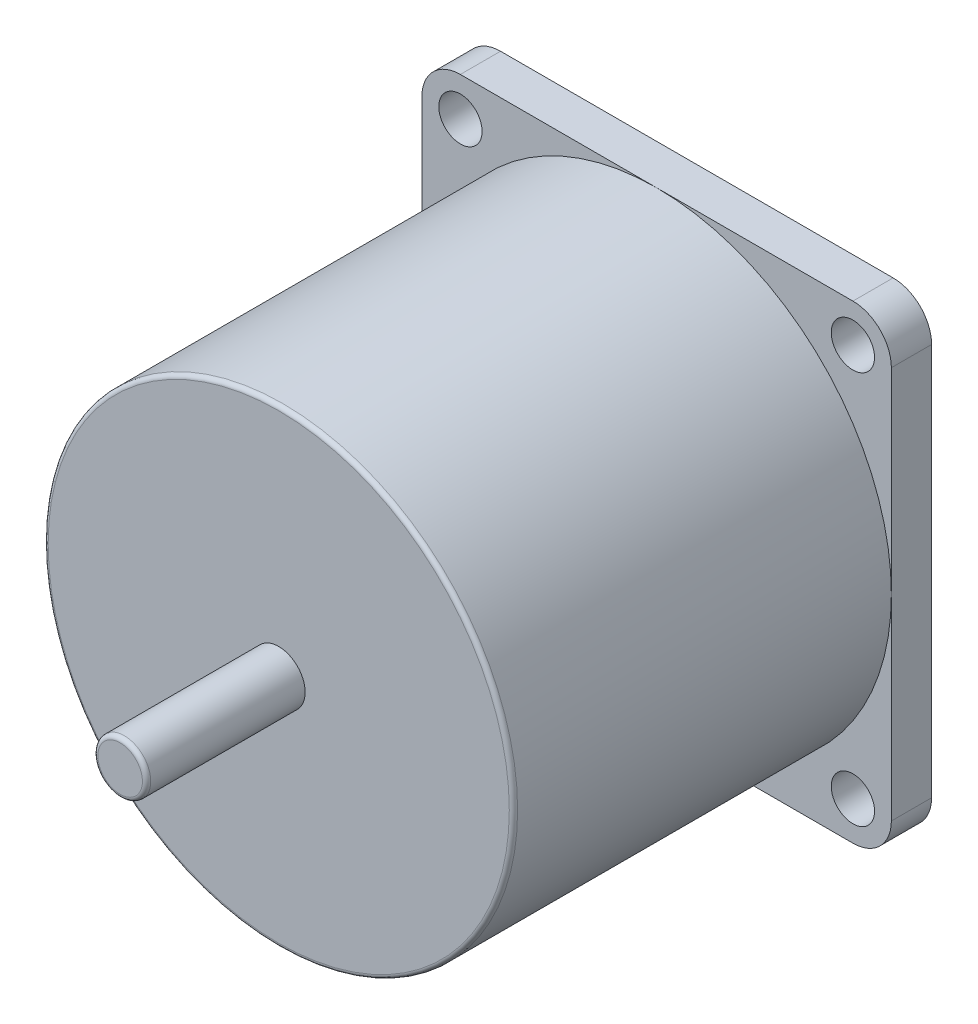
ISO-10303-21;
HEADER;
FILE_DESCRIPTION(('STEP AP214'),'2;1');
FILE_NAME('part.step','',(''),(''),'','','');
FILE_SCHEMA(('AUTOMOTIVE_DESIGN { 1 0 10303 214 1 1 1 1 }'));
ENDSEC;
DATA;
#1=APPLICATION_CONTEXT('core data for automotive mechanical design processes');
#2=APPLICATION_PROTOCOL_DEFINITION('international standard','automotive_design',2000,#1);
#3=PRODUCT_CONTEXT('',#1,'mechanical');
#4=PRODUCT('Part','Part','',(#3));
#5=PRODUCT_RELATED_PRODUCT_CATEGORY('part','',(#4));
#6=PRODUCT_DEFINITION_FORMATION('','',#4);
#7=PRODUCT_DEFINITION_CONTEXT('part definition',#1,'design');
#8=PRODUCT_DEFINITION('design','',#6,#7);
#9=PRODUCT_DEFINITION_SHAPE('','',#8);
#10=(LENGTH_UNIT() NAMED_UNIT(*) SI_UNIT(.MILLI.,.METRE.));
#11=(NAMED_UNIT(*) PLANE_ANGLE_UNIT() SI_UNIT($,.RADIAN.));
#12=(NAMED_UNIT(*) SI_UNIT($,.STERADIAN.) SOLID_ANGLE_UNIT());
#13=UNCERTAINTY_MEASURE_WITH_UNIT(LENGTH_MEASURE(1.E-05),#10,'distance_accuracy_value','');
#14=(GEOMETRIC_REPRESENTATION_CONTEXT(3) GLOBAL_UNCERTAINTY_ASSIGNED_CONTEXT((#13)) GLOBAL_UNIT_ASSIGNED_CONTEXT((#10,
#11,#12)) REPRESENTATION_CONTEXT('',''));
#15=CARTESIAN_POINT('',(0.,0.,0.));
#16=DIRECTION('',(0.,0.,1.));
#17=DIRECTION('',(1.,0.,0.));
#18=AXIS2_PLACEMENT_3D('',#15,#16,#17);
#19=CARTESIAN_POINT('',(0.,0.,50.23));
#20=DIRECTION('',(0.,0.,1.));
#21=DIRECTION('',(1.,0.,0.));
#22=AXIS2_PLACEMENT_3D('',#19,#20,#21);
#23=PLANE('',#22);
#24=CARTESIAN_POINT('',(0.,0.,50.23));
#25=DIRECTION('',(0.,0.,1.));
#26=DIRECTION('',(1.,0.,0.));
#27=AXIS2_PLACEMENT_3D('',#24,#25,#26);
#28=CIRCLE('',#27,27.7);
#29=CARTESIAN_POINT('',(27.7,0.,50.23));
#30=VERTEX_POINT('',#29);
#31=EDGE_CURVE('E41',#30,#30,#28,.T.);
#32=ORIENTED_EDGE('',*,*,#31,.T.);
#33=EDGE_LOOP('',(#32));
#34=FACE_BOUND('',#33,.T.);
#35=CARTESIAN_POINT('',(0.,0.,50.23));
#36=DIRECTION('',(0.,0.,1.));
#37=DIRECTION('',(1.,0.,0.));
#38=AXIS2_PLACEMENT_3D('',#35,#36,#37);
#39=CIRCLE('',#38,3.175);
#40=CARTESIAN_POINT('',(-3.175,0.,50.23));
#41=VERTEX_POINT('',#40);
#42=EDGE_CURVE('E347',#41,#41,#39,.T.);
#43=ORIENTED_EDGE('',*,*,#42,.F.);
#44=EDGE_LOOP('',(#43));
#45=FACE_BOUND('',#44,.T.);
#46=ADVANCED_FACE('F33',(#34,#45),#23,.T.);
#47=CARTESIAN_POINT('',(-23.58,23.58,4.83));
#48=DIRECTION('',(0.,0.,1.));
#49=DIRECTION('',(1.,0.,0.));
#50=AXIS2_PLACEMENT_3D('',#47,#48,#49);
#51=PLANE('',#50);
#52=CARTESIAN_POINT('',(0.,0.,4.83));
#53=DIRECTION('',(0.,0.,1.));
#54=DIRECTION('',(1.,0.,0.));
#55=AXIS2_PLACEMENT_3D('',#52,#53,#54);
#56=CIRCLE('',#55,28.2);
#57=CARTESIAN_POINT('',(28.2,0.,4.83));
#58=VERTEX_POINT('',#57);
#59=CARTESIAN_POINT('',(0.,28.2,4.83));
#60=VERTEX_POINT('',#59);
#61=EDGE_CURVE('E130',#58,#60,#56,.T.);
#62=ORIENTED_EDGE('',*,*,#61,.F.);
#63=DIRECTION('',(0.,1.,0.));
#64=VECTOR('',#63,1.);
#65=CARTESIAN_POINT('',(28.2,-23.58,4.83));
#66=LINE('',#65,#64);
#67=CARTESIAN_POINT('',(28.2,23.58,4.83));
#68=VERTEX_POINT('',#67);
#69=EDGE_CURVE('E119',#58,#68,#66,.T.);
#70=ORIENTED_EDGE('',*,*,#69,.T.);
#71=CARTESIAN_POINT('',(23.58,23.58,4.83));
#72=DIRECTION('',(0.,0.,1.));
#73=DIRECTION('',(1.,0.,0.));
#74=AXIS2_PLACEMENT_3D('',#71,#72,#73);
#75=CIRCLE('',#74,4.62);
#76=CARTESIAN_POINT('',(23.58,28.2,4.83));
#77=VERTEX_POINT('',#76);
#78=EDGE_CURVE('E118',#68,#77,#75,.T.);
#79=ORIENTED_EDGE('',*,*,#78,.T.);
#80=DIRECTION('',(-1.,0.,0.));
#81=VECTOR('',#80,1.);
#82=CARTESIAN_POINT('',(-23.58,28.2,4.83));
#83=LINE('',#82,#81);
#84=EDGE_CURVE('E134',#77,#60,#83,.T.);
#85=ORIENTED_EDGE('',*,*,#84,.T.);
#86=EDGE_LOOP('',(#62,#70,#79,#85));
#87=FACE_BOUND('',#86,.T.);
#88=CARTESIAN_POINT('',(23.5754506921737,23.629295607281,4.83));
#89=DIRECTION('',(0.,0.,1.));
#90=DIRECTION('',(1.,0.,0.));
#91=AXIS2_PLACEMENT_3D('',#88,#89,#90);
#92=CIRCLE('',#91,2.6);
#93=CARTESIAN_POINT('',(26.1754506921737,23.629295607281,4.83));
#94=VERTEX_POINT('',#93);
#95=EDGE_CURVE('E167',#94,#94,#92,.T.);
#96=ORIENTED_EDGE('',*,*,#95,.F.);
#97=EDGE_LOOP('',(#96));
#98=FACE_BOUND('',#97,.T.);
#99=ADVANCED_FACE('F131',(#87,#98),#51,.T.);
#100=CARTESIAN_POINT('',(-28.2,0.,4.83));
#101=VERTEX_POINT('',#100);
#102=EDGE_CURVE('E48',#60,#101,#56,.T.);
#103=ORIENTED_EDGE('',*,*,#102,.F.);
#104=CARTESIAN_POINT('',(-23.58,28.2,4.83));
#105=VERTEX_POINT('',#104);
#106=EDGE_CURVE('E194',#60,#105,#83,.T.);
#107=ORIENTED_EDGE('',*,*,#106,.T.);
#108=CARTESIAN_POINT('',(-23.58,23.58,4.83));
#109=DIRECTION('',(0.,0.,1.));
#110=DIRECTION('',(1.,0.,0.));
#111=AXIS2_PLACEMENT_3D('',#108,#109,#110);
#112=CIRCLE('',#111,4.62);
#113=CARTESIAN_POINT('',(-28.2,23.58,4.83));
#114=VERTEX_POINT('',#113);
#115=EDGE_CURVE('E179',#105,#114,#112,.T.);
#116=ORIENTED_EDGE('',*,*,#115,.T.);
#117=DIRECTION('',(0.,-1.,0.));
#118=VECTOR('',#117,1.);
#119=CARTESIAN_POINT('',(-28.2,-23.58,4.83));
#120=LINE('',#119,#118);
#121=EDGE_CURVE('E184',#114,#101,#120,.T.);
#122=ORIENTED_EDGE('',*,*,#121,.T.);
#123=EDGE_LOOP('',(#103,#107,#116,#122));
#124=FACE_BOUND('',#123,.T.);
#125=CARTESIAN_POINT('',(-23.57,23.57,4.83));
#126=DIRECTION('',(0.,0.,1.));
#127=DIRECTION('',(1.,0.,0.));
#128=AXIS2_PLACEMENT_3D('',#125,#126,#127);
#129=CIRCLE('',#128,2.6);
#130=CARTESIAN_POINT('',(-20.97,23.57,4.83));
#131=VERTEX_POINT('',#130);
#132=EDGE_CURVE('E173',#131,#131,#129,.T.);
#133=ORIENTED_EDGE('',*,*,#132,.F.);
#134=EDGE_LOOP('',(#133));
#135=FACE_BOUND('',#134,.T.);
#136=ADVANCED_FACE('F258',(#124,#135),#51,.T.);
#137=CARTESIAN_POINT('',(0.,-28.2,4.83));
#138=VERTEX_POINT('',#137);
#139=EDGE_CURVE('E141',#101,#138,#56,.T.);
#140=ORIENTED_EDGE('',*,*,#139,.F.);
#141=CARTESIAN_POINT('',(-28.2,-23.58,4.83));
#142=VERTEX_POINT('',#141);
#143=EDGE_CURVE('E182',#101,#142,#120,.T.);
#144=ORIENTED_EDGE('',*,*,#143,.T.);
#145=CARTESIAN_POINT('',(-23.58,-23.58,4.83));
#146=DIRECTION('',(0.,0.,1.));
#147=DIRECTION('',(1.,0.,0.));
#148=AXIS2_PLACEMENT_3D('',#145,#146,#147);
#149=CIRCLE('',#148,4.62);
#150=CARTESIAN_POINT('',(-23.58,-28.2,4.83));
#151=VERTEX_POINT('',#150);
#152=EDGE_CURVE('E186',#142,#151,#149,.T.);
#153=ORIENTED_EDGE('',*,*,#152,.T.);
#154=DIRECTION('',(1.,0.,0.));
#155=VECTOR('',#154,1.);
#156=CARTESIAN_POINT('',(-23.58,-28.2,4.83));
#157=LINE('',#156,#155);
#158=EDGE_CURVE('E189',#151,#138,#157,.T.);
#159=ORIENTED_EDGE('',*,*,#158,.T.);
#160=EDGE_LOOP('',(#140,#144,#153,#159));
#161=FACE_BOUND('',#160,.T.);
#162=CARTESIAN_POINT('',(-23.58,-23.58,4.83));
#163=DIRECTION('',(0.,0.,1.));
#164=DIRECTION('',(1.,0.,0.));
#165=AXIS2_PLACEMENT_3D('',#162,#163,#164);
#166=CIRCLE('',#165,2.6);
#167=CARTESIAN_POINT('',(-20.98,-23.58,4.83));
#168=VERTEX_POINT('',#167);
#169=EDGE_CURVE('E155',#168,#168,#166,.T.);
#170=ORIENTED_EDGE('',*,*,#169,.F.);
#171=EDGE_LOOP('',(#170));
#172=FACE_BOUND('',#171,.T.);
#173=ADVANCED_FACE('F294',(#161,#172),#51,.T.);
#174=EDGE_CURVE('E56',#138,#58,#56,.T.);
#175=ORIENTED_EDGE('',*,*,#174,.F.);
#176=CARTESIAN_POINT('',(23.58,-28.2,4.83));
#177=VERTEX_POINT('',#176);
#178=EDGE_CURVE('E188',#138,#177,#157,.T.);
#179=ORIENTED_EDGE('',*,*,#178,.T.);
#180=CARTESIAN_POINT('',(23.58,-23.58,4.83));
#181=DIRECTION('',(0.,0.,1.));
#182=DIRECTION('',(1.,0.,0.));
#183=AXIS2_PLACEMENT_3D('',#180,#181,#182);
#184=CIRCLE('',#183,4.62);
#185=CARTESIAN_POINT('',(28.2,-23.58,4.83));
#186=VERTEX_POINT('',#185);
#187=EDGE_CURVE('E114',#177,#186,#184,.T.);
#188=ORIENTED_EDGE('',*,*,#187,.T.);
#189=EDGE_CURVE('E109',#186,#58,#66,.T.);
#190=ORIENTED_EDGE('',*,*,#189,.T.);
#191=EDGE_LOOP('',(#175,#179,#188,#190));
#192=FACE_BOUND('',#191,.T.);
#193=CARTESIAN_POINT('',(23.58,-23.58,4.83));
#194=DIRECTION('',(0.,0.,1.));
#195=DIRECTION('',(1.,0.,0.));
#196=AXIS2_PLACEMENT_3D('',#193,#194,#195);
#197=CIRCLE('',#196,2.6);
#198=CARTESIAN_POINT('',(26.18,-23.58,4.83));
#199=VERTEX_POINT('',#198);
#200=EDGE_CURVE('E161',#199,#199,#197,.T.);
#201=ORIENTED_EDGE('',*,*,#200,.F.);
#202=EDGE_LOOP('',(#201));
#203=FACE_BOUND('',#202,.T.);
#204=ADVANCED_FACE('F111',(#192,#203),#51,.T.);
#205=CARTESIAN_POINT('',(-23.58,23.58,0.));
#206=DIRECTION('',(0.,0.,1.));
#207=DIRECTION('',(1.,0.,0.));
#208=AXIS2_PLACEMENT_3D('',#205,#206,#207);
#209=PLANE('',#208);
#210=CARTESIAN_POINT('',(0.,0.,0.));
#211=DIRECTION('',(0.,0.,1.));
#212=DIRECTION('',(1.,0.,0.));
#213=AXIS2_PLACEMENT_3D('',#210,#211,#212);
#214=CIRCLE('',#213,19.05);
#215=CARTESIAN_POINT('',(19.05,0.,0.));
#216=VERTEX_POINT('',#215);
#217=EDGE_CURVE('E136',#216,#216,#214,.T.);
#218=ORIENTED_EDGE('',*,*,#217,.T.);
#219=EDGE_LOOP('',(#218));
#220=FACE_BOUND('',#219,.T.);
#221=CARTESIAN_POINT('',(23.58,-23.58,0.));
#222=DIRECTION('',(0.,0.,1.));
#223=DIRECTION('',(1.,0.,0.));
#224=AXIS2_PLACEMENT_3D('',#221,#222,#223);
#225=CIRCLE('',#224,2.6);
#226=CARTESIAN_POINT('',(26.18,-23.58,0.));
#227=VERTEX_POINT('',#226);
#228=EDGE_CURVE('E158',#227,#227,#225,.T.);
#229=ORIENTED_EDGE('',*,*,#228,.T.);
#230=EDGE_LOOP('',(#229));
#231=FACE_BOUND('',#230,.T.);
#232=CARTESIAN_POINT('',(-23.57,23.57,0.));
#233=DIRECTION('',(0.,0.,1.));
#234=DIRECTION('',(1.,0.,0.));
#235=AXIS2_PLACEMENT_3D('',#232,#233,#234);
#236=CIRCLE('',#235,2.6);
#237=CARTESIAN_POINT('',(-20.97,23.57,0.));
#238=VERTEX_POINT('',#237);
#239=EDGE_CURVE('E170',#238,#238,#236,.T.);
#240=ORIENTED_EDGE('',*,*,#239,.T.);
#241=EDGE_LOOP('',(#240));
#242=FACE_BOUND('',#241,.T.);
#243=CARTESIAN_POINT('',(-23.58,23.58,0.));
#244=DIRECTION('',(0.,0.,1.));
#245=DIRECTION('',(1.,0.,0.));
#246=AXIS2_PLACEMENT_3D('',#243,#244,#245);
#247=CIRCLE('',#246,4.62);
#248=CARTESIAN_POINT('',(-23.58,28.2,0.));
#249=VERTEX_POINT('',#248);
#250=CARTESIAN_POINT('',(-28.2,23.58,0.));
#251=VERTEX_POINT('',#250);
#252=EDGE_CURVE('E176',#249,#251,#247,.T.);
#253=ORIENTED_EDGE('',*,*,#252,.F.);
#254=DIRECTION('',(-1.,0.,0.));
#255=VECTOR('',#254,1.);
#256=CARTESIAN_POINT('',(-23.58,28.2,0.));
#257=LINE('',#256,#255);
#258=CARTESIAN_POINT('',(23.58,28.2,0.));
#259=VERTEX_POINT('',#258);
#260=EDGE_CURVE('E183',#259,#249,#257,.T.);
#261=ORIENTED_EDGE('',*,*,#260,.F.);
#262=CARTESIAN_POINT('',(23.58,23.58,0.));
#263=DIRECTION('',(0.,0.,1.));
#264=DIRECTION('',(1.,0.,0.));
#265=AXIS2_PLACEMENT_3D('',#262,#263,#264);
#266=CIRCLE('',#265,4.62);
#267=CARTESIAN_POINT('',(28.2,23.58,0.));
#268=VERTEX_POINT('',#267);
#269=EDGE_CURVE('E209',#268,#259,#266,.T.);
#270=ORIENTED_EDGE('',*,*,#269,.F.);
#271=DIRECTION('',(0.,1.,0.));
#272=VECTOR('',#271,1.);
#273=CARTESIAN_POINT('',(28.2,-23.58,0.));
#274=LINE('',#273,#272);
#275=CARTESIAN_POINT('',(28.2,-23.58,0.));
#276=VERTEX_POINT('',#275);
#277=EDGE_CURVE('E207',#276,#268,#274,.T.);
#278=ORIENTED_EDGE('',*,*,#277,.F.);
#279=CARTESIAN_POINT('',(23.58,-23.58,0.));
#280=DIRECTION('',(0.,0.,1.));
#281=DIRECTION('',(1.,0.,0.));
#282=AXIS2_PLACEMENT_3D('',#279,#280,#281);
#283=CIRCLE('',#282,4.62);
#284=CARTESIAN_POINT('',(23.58,-28.2,0.));
#285=VERTEX_POINT('',#284);
#286=EDGE_CURVE('E205',#285,#276,#283,.T.);
#287=ORIENTED_EDGE('',*,*,#286,.F.);
#288=DIRECTION('',(1.,0.,0.));
#289=VECTOR('',#288,1.);
#290=CARTESIAN_POINT('',(-23.58,-28.2,0.));
#291=LINE('',#290,#289);
#292=CARTESIAN_POINT('',(-23.58,-28.2,0.));
#293=VERTEX_POINT('',#292);
#294=EDGE_CURVE('E203',#293,#285,#291,.T.);
#295=ORIENTED_EDGE('',*,*,#294,.F.);
#296=CARTESIAN_POINT('',(-23.58,-23.58,0.));
#297=DIRECTION('',(0.,0.,1.));
#298=DIRECTION('',(1.,0.,0.));
#299=AXIS2_PLACEMENT_3D('',#296,#297,#298);
#300=CIRCLE('',#299,4.62);
#301=CARTESIAN_POINT('',(-28.2,-23.58,0.));
#302=VERTEX_POINT('',#301);
#303=EDGE_CURVE('E201',#302,#293,#300,.T.);
#304=ORIENTED_EDGE('',*,*,#303,.F.);
#305=DIRECTION('',(0.,-1.,0.));
#306=VECTOR('',#305,1.);
#307=CARTESIAN_POINT('',(-28.2,-23.58,0.));
#308=LINE('',#307,#306);
#309=EDGE_CURVE('E199',#251,#302,#308,.T.);
#310=ORIENTED_EDGE('',*,*,#309,.F.);
#311=EDGE_LOOP('',(#253,#261,#270,#278,#287,#295,#304,#310));
#312=FACE_BOUND('',#311,.T.);
#313=CARTESIAN_POINT('',(23.5754506921737,23.629295607281,0.));
#314=DIRECTION('',(0.,0.,1.));
#315=DIRECTION('',(1.,0.,0.));
#316=AXIS2_PLACEMENT_3D('',#313,#314,#315);
#317=CIRCLE('',#316,2.6);
#318=CARTESIAN_POINT('',(26.1754506921737,23.629295607281,0.));
#319=VERTEX_POINT('',#318);
#320=EDGE_CURVE('E164',#319,#319,#317,.T.);
#321=ORIENTED_EDGE('',*,*,#320,.T.);
#322=EDGE_LOOP('',(#321));
#323=FACE_BOUND('',#322,.T.);
#324=CARTESIAN_POINT('',(-23.58,-23.58,0.));
#325=DIRECTION('',(0.,0.,1.));
#326=DIRECTION('',(1.,0.,0.));
#327=AXIS2_PLACEMENT_3D('',#324,#325,#326);
#328=CIRCLE('',#327,2.6);
#329=CARTESIAN_POINT('',(-20.98,-23.58,0.));
#330=VERTEX_POINT('',#329);
#331=EDGE_CURVE('E152',#330,#330,#328,.T.);
#332=ORIENTED_EDGE('',*,*,#331,.T.);
#333=EDGE_LOOP('',(#332));
#334=FACE_BOUND('',#333,.T.);
#335=ADVANCED_FACE('F293',(#220,#231,#242,#312,#323,#334),#209,.F.);
#336=CARTESIAN_POINT('',(-23.58,23.58,4.83));
#337=DIRECTION('',(0.,0.,-1.));
#338=DIRECTION('',(-1.,0.,0.));
#339=AXIS2_PLACEMENT_3D('',#336,#337,#338);
#340=CYLINDRICAL_SURFACE('',#339,4.62);
#341=ORIENTED_EDGE('',*,*,#252,.T.);
#342=DIRECTION('',(0.,0.,-1.));
#343=VECTOR('',#342,1.);
#344=CARTESIAN_POINT('',(-28.2,23.58,4.83));
#345=LINE('',#344,#343);
#346=EDGE_CURVE('E142',#114,#251,#345,.T.);
#347=ORIENTED_EDGE('',*,*,#346,.F.);
#348=ORIENTED_EDGE('',*,*,#115,.F.);
#349=DIRECTION('',(0.,0.,-1.));
#350=VECTOR('',#349,1.);
#351=CARTESIAN_POINT('',(-23.58,28.2,4.83));
#352=LINE('',#351,#350);
#353=EDGE_CURVE('E196',#105,#249,#352,.T.);
#354=ORIENTED_EDGE('',*,*,#353,.T.);
#355=EDGE_LOOP('',(#341,#347,#348,#354));
#356=FACE_BOUND('',#355,.T.);
#357=ADVANCED_FACE('F297',(#356),#340,.T.);
#358=CARTESIAN_POINT('',(-28.2,-23.58,4.83));
#359=DIRECTION('',(1.,0.,0.));
#360=DIRECTION('',(0.,0.,-1.));
#361=AXIS2_PLACEMENT_3D('',#358,#359,#360);
#362=PLANE('',#361);
#363=ORIENTED_EDGE('',*,*,#309,.T.);
#364=DIRECTION('',(0.,0.,-1.));
#365=VECTOR('',#364,1.);
#366=CARTESIAN_POINT('',(-28.2,-23.58,4.83));
#367=LINE('',#366,#365);
#368=EDGE_CURVE('E144',#142,#302,#367,.T.);
#369=ORIENTED_EDGE('',*,*,#368,.F.);
#370=ORIENTED_EDGE('',*,*,#143,.F.);
#371=ORIENTED_EDGE('',*,*,#121,.F.);
#372=ORIENTED_EDGE('',*,*,#346,.T.);
#373=EDGE_LOOP('',(#363,#369,#370,#371,#372));
#374=FACE_BOUND('',#373,.T.);
#375=ADVANCED_FACE('F319',(#374),#362,.F.);
#376=CARTESIAN_POINT('',(-23.58,-23.58,4.83));
#377=DIRECTION('',(0.,0.,-1.));
#378=DIRECTION('',(-1.,0.,0.));
#379=AXIS2_PLACEMENT_3D('',#376,#377,#378);
#380=CYLINDRICAL_SURFACE('',#379,4.62);
#381=ORIENTED_EDGE('',*,*,#303,.T.);
#382=DIRECTION('',(0.,0.,-1.));
#383=VECTOR('',#382,1.);
#384=CARTESIAN_POINT('',(-23.58,-28.2,4.83));
#385=LINE('',#384,#383);
#386=EDGE_CURVE('E223',#151,#293,#385,.T.);
#387=ORIENTED_EDGE('',*,*,#386,.F.);
#388=ORIENTED_EDGE('',*,*,#152,.F.);
#389=ORIENTED_EDGE('',*,*,#368,.T.);
#390=EDGE_LOOP('',(#381,#387,#388,#389));
#391=FACE_BOUND('',#390,.T.);
#392=ADVANCED_FACE('F315',(#391),#380,.T.);
#393=CARTESIAN_POINT('',(-23.58,-28.2,4.83));
#394=DIRECTION('',(0.,1.,0.));
#395=DIRECTION('',(0.,0.,1.));
#396=AXIS2_PLACEMENT_3D('',#393,#394,#395);
#397=PLANE('',#396);
#398=ORIENTED_EDGE('',*,*,#294,.T.);
#399=DIRECTION('',(0.,0.,-1.));
#400=VECTOR('',#399,1.);
#401=CARTESIAN_POINT('',(23.58,-28.2,4.83));
#402=LINE('',#401,#400);
#403=EDGE_CURVE('E220',#177,#285,#402,.T.);
#404=ORIENTED_EDGE('',*,*,#403,.F.);
#405=ORIENTED_EDGE('',*,*,#178,.F.);
#406=ORIENTED_EDGE('',*,*,#158,.F.);
#407=ORIENTED_EDGE('',*,*,#386,.T.);
#408=EDGE_LOOP('',(#398,#404,#405,#406,#407));
#409=FACE_BOUND('',#408,.T.);
#410=ADVANCED_FACE('F311',(#409),#397,.F.);
#411=CARTESIAN_POINT('',(23.58,-23.58,4.83));
#412=DIRECTION('',(0.,0.,-1.));
#413=DIRECTION('',(-1.,0.,0.));
#414=AXIS2_PLACEMENT_3D('',#411,#412,#413);
#415=CYLINDRICAL_SURFACE('',#414,4.62);
#416=ORIENTED_EDGE('',*,*,#286,.T.);
#417=DIRECTION('',(0.,0.,-1.));
#418=VECTOR('',#417,1.);
#419=CARTESIAN_POINT('',(28.2,-23.58,4.83));
#420=LINE('',#419,#418);
#421=EDGE_CURVE('E218',#186,#276,#420,.T.);
#422=ORIENTED_EDGE('',*,*,#421,.F.);
#423=ORIENTED_EDGE('',*,*,#187,.F.);
#424=ORIENTED_EDGE('',*,*,#403,.T.);
#425=EDGE_LOOP('',(#416,#422,#423,#424));
#426=FACE_BOUND('',#425,.T.);
#427=ADVANCED_FACE('F308',(#426),#415,.T.);
#428=CARTESIAN_POINT('',(28.2,-23.58,4.83));
#429=DIRECTION('',(-1.,0.,0.));
#430=DIRECTION('',(0.,0.,1.));
#431=AXIS2_PLACEMENT_3D('',#428,#429,#430);
#432=PLANE('',#431);
#433=ORIENTED_EDGE('',*,*,#277,.T.);
#434=DIRECTION('',(0.,0.,-1.));
#435=VECTOR('',#434,1.);
#436=CARTESIAN_POINT('',(28.2,23.58,4.83));
#437=LINE('',#436,#435);
#438=EDGE_CURVE('E125',#68,#268,#437,.T.);
#439=ORIENTED_EDGE('',*,*,#438,.F.);
#440=ORIENTED_EDGE('',*,*,#69,.F.);
#441=ORIENTED_EDGE('',*,*,#189,.F.);
#442=ORIENTED_EDGE('',*,*,#421,.T.);
#443=EDGE_LOOP('',(#433,#439,#440,#441,#442));
#444=FACE_BOUND('',#443,.T.);
#445=ADVANCED_FACE('F123',(#444),#432,.F.);
#446=CARTESIAN_POINT('',(23.58,23.58,4.83));
#447=DIRECTION('',(0.,0.,-1.));
#448=DIRECTION('',(-1.,0.,0.));
#449=AXIS2_PLACEMENT_3D('',#446,#447,#448);
#450=CYLINDRICAL_SURFACE('',#449,4.62);
#451=ORIENTED_EDGE('',*,*,#269,.T.);
#452=DIRECTION('',(0.,0.,-1.));
#453=VECTOR('',#452,1.);
#454=CARTESIAN_POINT('',(23.58,28.2,4.83));
#455=LINE('',#454,#453);
#456=EDGE_CURVE('E214',#77,#259,#455,.T.);
#457=ORIENTED_EDGE('',*,*,#456,.F.);
#458=ORIENTED_EDGE('',*,*,#78,.F.);
#459=ORIENTED_EDGE('',*,*,#438,.T.);
#460=EDGE_LOOP('',(#451,#457,#458,#459));
#461=FACE_BOUND('',#460,.T.);
#462=ADVANCED_FACE('F301',(#461),#450,.T.);
#463=CARTESIAN_POINT('',(-23.58,28.2,4.83));
#464=DIRECTION('',(0.,-1.,0.));
#465=DIRECTION('',(0.,0.,-1.));
#466=AXIS2_PLACEMENT_3D('',#463,#464,#465);
#467=PLANE('',#466);
#468=ORIENTED_EDGE('',*,*,#260,.T.);
#469=ORIENTED_EDGE('',*,*,#353,.F.);
#470=ORIENTED_EDGE('',*,*,#106,.F.);
#471=ORIENTED_EDGE('',*,*,#84,.F.);
#472=ORIENTED_EDGE('',*,*,#456,.T.);
#473=EDGE_LOOP('',(#468,#469,#470,#471,#472));
#474=FACE_BOUND('',#473,.T.);
#475=ADVANCED_FACE('F289',(#474),#467,.F.);
#476=CARTESIAN_POINT('',(-23.57,23.57,4.83));
#477=DIRECTION('',(0.,0.,-1.));
#478=DIRECTION('',(-1.,0.,0.));
#479=AXIS2_PLACEMENT_3D('',#476,#477,#478);
#480=CYLINDRICAL_SURFACE('',#479,2.6);
#481=ORIENTED_EDGE('',*,*,#132,.T.);
#482=EDGE_LOOP('',(#481));
#483=FACE_BOUND('',#482,.T.);
#484=ORIENTED_EDGE('',*,*,#239,.F.);
#485=EDGE_LOOP('',(#484));
#486=FACE_BOUND('',#485,.T.);
#487=ADVANCED_FACE('F286',(#483,#486),#480,.F.);
#488=CARTESIAN_POINT('',(23.5754506921737,23.629295607281,4.83));
#489=DIRECTION('',(0.,0.,-1.));
#490=DIRECTION('',(-1.,0.,0.));
#491=AXIS2_PLACEMENT_3D('',#488,#489,#490);
#492=CYLINDRICAL_SURFACE('',#491,2.6);
#493=ORIENTED_EDGE('',*,*,#95,.T.);
#494=EDGE_LOOP('',(#493));
#495=FACE_BOUND('',#494,.T.);
#496=ORIENTED_EDGE('',*,*,#320,.F.);
#497=EDGE_LOOP('',(#496));
#498=FACE_BOUND('',#497,.T.);
#499=ADVANCED_FACE('F282',(#495,#498),#492,.F.);
#500=CARTESIAN_POINT('',(23.58,-23.58,4.83));
#501=DIRECTION('',(0.,0.,-1.));
#502=DIRECTION('',(-1.,0.,0.));
#503=AXIS2_PLACEMENT_3D('',#500,#501,#502);
#504=CYLINDRICAL_SURFACE('',#503,2.6);
#505=ORIENTED_EDGE('',*,*,#200,.T.);
#506=EDGE_LOOP('',(#505));
#507=FACE_BOUND('',#506,.T.);
#508=ORIENTED_EDGE('',*,*,#228,.F.);
#509=EDGE_LOOP('',(#508));
#510=FACE_BOUND('',#509,.T.);
#511=ADVANCED_FACE('F278',(#507,#510),#504,.F.);
#512=CARTESIAN_POINT('',(-23.58,-23.58,4.83));
#513=DIRECTION('',(0.,0.,-1.));
#514=DIRECTION('',(-1.,0.,0.));
#515=AXIS2_PLACEMENT_3D('',#512,#513,#514);
#516=CYLINDRICAL_SURFACE('',#515,2.6);
#517=ORIENTED_EDGE('',*,*,#169,.T.);
#518=EDGE_LOOP('',(#517));
#519=FACE_BOUND('',#518,.T.);
#520=ORIENTED_EDGE('',*,*,#331,.F.);
#521=EDGE_LOOP('',(#520));
#522=FACE_BOUND('',#521,.T.);
#523=ADVANCED_FACE('F274',(#519,#522),#516,.F.);
#524=CARTESIAN_POINT('',(0.,0.,-1.52));
#525=DIRECTION('',(0.,0.,1.));
#526=DIRECTION('',(1.,0.,0.));
#527=AXIS2_PLACEMENT_3D('',#524,#525,#526);
#528=CYLINDRICAL_SURFACE('',#527,19.05);
#529=CARTESIAN_POINT('',(0.,0.,-1.52));
#530=DIRECTION('',(0.,0.,1.));
#531=DIRECTION('',(1.,0.,0.));
#532=AXIS2_PLACEMENT_3D('',#529,#530,#531);
#533=CIRCLE('',#532,19.05);
#534=CARTESIAN_POINT('',(19.05,0.,-1.52));
#535=VERTEX_POINT('',#534);
#536=EDGE_CURVE('E149',#535,#535,#533,.T.);
#537=ORIENTED_EDGE('',*,*,#536,.T.);
#538=EDGE_LOOP('',(#537));
#539=FACE_BOUND('',#538,.T.);
#540=ORIENTED_EDGE('',*,*,#217,.F.);
#541=EDGE_LOOP('',(#540));
#542=FACE_BOUND('',#541,.T.);
#543=ADVANCED_FACE('F270',(#539,#542),#528,.T.);
#544=CARTESIAN_POINT('',(0.,0.,-1.52));
#545=DIRECTION('',(0.,0.,1.));
#546=DIRECTION('',(1.,0.,0.));
#547=AXIS2_PLACEMENT_3D('',#544,#545,#546);
#548=PLANE('',#547);
#549=CARTESIAN_POINT('',(0.,0.,-1.52));
#550=DIRECTION('',(0.,0.,1.));
#551=DIRECTION('',(1.,0.,0.));
#552=AXIS2_PLACEMENT_3D('',#549,#550,#551);
#553=CIRCLE('',#552,3.175);
#554=CARTESIAN_POINT('',(3.175,0.,-1.52));
#555=VERTEX_POINT('',#554);
#556=EDGE_CURVE('E137',#555,#555,#553,.F.);
#557=ORIENTED_EDGE('',*,*,#556,.F.);
#558=EDGE_LOOP('',(#557));
#559=FACE_BOUND('',#558,.T.);
#560=ORIENTED_EDGE('',*,*,#536,.F.);
#561=EDGE_LOOP('',(#560));
#562=FACE_BOUND('',#561,.T.);
#563=ADVANCED_FACE('F266',(#559,#562),#548,.F.);
#564=CARTESIAN_POINT('',(0.,0.,50.23));
#565=DIRECTION('',(0.,0.,-1.));
#566=DIRECTION('',(-1.,0.,0.));
#567=AXIS2_PLACEMENT_3D('',#564,#565,#566);
#568=CYLINDRICAL_SURFACE('',#567,28.2);
#569=CARTESIAN_POINT('',(0.,0.,49.73));
#570=DIRECTION('',(0.,0.,1.));
#571=DIRECTION('',(1.,0.,0.));
#572=AXIS2_PLACEMENT_3D('',#569,#570,#571);
#573=CIRCLE('',#572,28.2);
#574=CARTESIAN_POINT('',(28.2,0.,49.73));
#575=VERTEX_POINT('',#574);
#576=EDGE_CURVE('E11',#575,#575,#573,.F.);
#577=ORIENTED_EDGE('',*,*,#576,.T.);
#578=EDGE_LOOP('',(#577));
#579=FACE_BOUND('',#578,.T.);
#580=ORIENTED_EDGE('',*,*,#61,.T.);
#581=ORIENTED_EDGE('',*,*,#102,.T.);
#582=ORIENTED_EDGE('',*,*,#139,.T.);
#583=ORIENTED_EDGE('',*,*,#174,.T.);
#584=EDGE_LOOP('',(#580,#581,#582,#583));
#585=FACE_BOUND('',#584,.T.);
#586=ADVANCED_FACE('F140',(#579,#585),#568,.T.);
#587=CARTESIAN_POINT('',(0.,0.,-15.77));
#588=DIRECTION('',(0.,0.,1.));
#589=DIRECTION('',(1.,0.,0.));
#590=AXIS2_PLACEMENT_3D('',#587,#588,#589);
#591=CYLINDRICAL_SURFACE('',#590,3.175);
#592=CARTESIAN_POINT('',(0.,0.,-15.27));
#593=DIRECTION('',(0.,0.,-1.));
#594=DIRECTION('',(-1.,0.,0.));
#595=AXIS2_PLACEMENT_3D('',#592,#593,#594);
#596=CIRCLE('',#595,3.175);
#597=CARTESIAN_POINT('',(3.175,0.,-15.27));
#598=VERTEX_POINT('',#597);
#599=EDGE_CURVE('E231',#598,#598,#596,.F.);
#600=CARTESIAN_POINT('',(3.175,0.,-15.27));
#601=CARTESIAN_POINT('',(3.175,0.,-15.1267708333333));
#602=CARTESIAN_POINT('',(3.175,0.,-14.9835416666667));
#603=CARTESIAN_POINT('',(3.175,0.,-14.6970833333333));
#604=CARTESIAN_POINT('',(3.175,0.,-14.5538541666667));
#605=CARTESIAN_POINT('',(3.175,0.,-14.2673958333333));
#606=CARTESIAN_POINT('',(3.175,0.,-14.1241666666667));
#607=CARTESIAN_POINT('',(3.175,0.,-13.8377083333333));
#608=CARTESIAN_POINT('',(3.175,0.,-13.6944791666667));
#609=CARTESIAN_POINT('',(3.175,0.,-13.4080208333333));
#610=CARTESIAN_POINT('',(3.175,0.,-13.2647916666667));
#611=CARTESIAN_POINT('',(3.175,0.,-12.9783333333333));
#612=CARTESIAN_POINT('',(3.175,0.,-12.8351041666667));
#613=CARTESIAN_POINT('',(3.175,0.,-12.5486458333333));
#614=CARTESIAN_POINT('',(3.175,0.,-12.4054166666667));
#615=CARTESIAN_POINT('',(3.175,0.,-12.1189583333333));
#616=CARTESIAN_POINT('',(3.175,0.,-11.9757291666667));
#617=CARTESIAN_POINT('',(3.175,0.,-11.6892708333333));
#618=CARTESIAN_POINT('',(3.175,0.,-11.5460416666667));
#619=CARTESIAN_POINT('',(3.175,0.,-11.2595833333333));
#620=CARTESIAN_POINT('',(3.175,0.,-11.1163541666667));
#621=CARTESIAN_POINT('',(3.175,0.,-10.8298958333333));
#622=CARTESIAN_POINT('',(3.175,0.,-10.6866666666667));
#623=CARTESIAN_POINT('',(3.175,0.,-10.4002083333333));
#624=CARTESIAN_POINT('',(3.175,0.,-10.2569791666667));
#625=CARTESIAN_POINT('',(3.175,0.,-9.97052083333334));
#626=CARTESIAN_POINT('',(3.175,0.,-9.82729166666667));
#627=CARTESIAN_POINT('',(3.175,0.,-9.54083333333333));
#628=CARTESIAN_POINT('',(3.175,0.,-9.39760416666667));
#629=CARTESIAN_POINT('',(3.175,0.,-9.11114583333333));
#630=CARTESIAN_POINT('',(3.175,0.,-8.96791666666667));
#631=CARTESIAN_POINT('',(3.175,0.,-8.68145833333334));
#632=CARTESIAN_POINT('',(3.175,0.,-8.53822916666667));
#633=CARTESIAN_POINT('',(3.175,0.,-8.25177083333333));
#634=CARTESIAN_POINT('',(3.175,0.,-8.10854166666667));
#635=CARTESIAN_POINT('',(3.175,0.,-7.82208333333334));
#636=CARTESIAN_POINT('',(3.175,0.,-7.67885416666667));
#637=CARTESIAN_POINT('',(3.175,0.,-7.39239583333333));
#638=CARTESIAN_POINT('',(3.175,0.,-7.24916666666667));
#639=CARTESIAN_POINT('',(3.175,0.,-6.96270833333333));
#640=CARTESIAN_POINT('',(3.175,0.,-6.81947916666667));
#641=CARTESIAN_POINT('',(3.175,0.,-6.53302083333333));
#642=CARTESIAN_POINT('',(3.175,0.,-6.38979166666667));
#643=CARTESIAN_POINT('',(3.175,0.,-6.10333333333333));
#644=CARTESIAN_POINT('',(3.175,0.,-5.96010416666667));
#645=CARTESIAN_POINT('',(3.175,0.,-5.67364583333333));
#646=CARTESIAN_POINT('',(3.175,0.,-5.53041666666667));
#647=CARTESIAN_POINT('',(3.175,0.,-5.24395833333334));
#648=CARTESIAN_POINT('',(3.175,0.,-5.10072916666667));
#649=CARTESIAN_POINT('',(3.175,0.,-4.81427083333334));
#650=CARTESIAN_POINT('',(3.175,0.,-4.67104166666667));
#651=CARTESIAN_POINT('',(3.175,0.,-4.38458333333334));
#652=CARTESIAN_POINT('',(3.175,0.,-4.24135416666667));
#653=CARTESIAN_POINT('',(3.175,0.,-3.95489583333333));
#654=CARTESIAN_POINT('',(3.175,0.,-3.81166666666667));
#655=CARTESIAN_POINT('',(3.175,0.,-3.52520833333334));
#656=CARTESIAN_POINT('',(3.175,0.,-3.38197916666667));
#657=CARTESIAN_POINT('',(3.175,0.,-3.09552083333334));
#658=CARTESIAN_POINT('',(3.175,0.,-2.95229166666667));
#659=CARTESIAN_POINT('',(3.175,0.,-2.66583333333334));
#660=CARTESIAN_POINT('',(3.175,0.,-2.52260416666667));
#661=CARTESIAN_POINT('',(3.175,0.,-2.23614583333333));
#662=CARTESIAN_POINT('',(3.175,0.,-2.09291666666667));
#663=CARTESIAN_POINT('',(3.175,0.,-1.80645833333334));
#664=CARTESIAN_POINT('',(3.175,0.,-1.66322916666667));
#665=CARTESIAN_POINT('',(3.175,0.,-1.52));
#666=B_SPLINE_CURVE_WITH_KNOTS('',3,(#600,#601,#602,#603,#604,#605,#606,#607,#608,#609,#610,
#611,#612,#613,#614,#615,#616,#617,#618,#619,#620,#621,#622,#623,#624,#625,#626,#627,#628,#629,
#630,#631,#632,#633,#634,#635,#636,#637,#638,#639,#640,#641,#642,#643,#644,#645,#646,#647,#648,
#649,#650,#651,#652,#653,#654,#655,#656,#657,#658,#659,#660,#661,#662,#663,#664,#665),
.UNSPECIFIED.,.F.,.F.,(4,2,2,2,2,2,2,2,2,2,2,2,2,2,2,2,2,2,2,2,2,2,2,2,2,2,2,2,2,2,2,2,4),(0.,
0.4296875,0.859374999999999,1.2890625,1.71875,2.1484375,2.578125,3.0078125,3.4375,3.8671875,
4.296875,4.7265625,5.15625,5.5859375,6.015625,6.4453125,6.875,7.3046875,7.734375,8.1640625,
8.59374999999999,9.0234375,9.453125,9.8828125,10.3125,10.7421875,11.171875,11.6015625,12.03125,
12.4609375,12.890625,13.3203125,13.75),.UNSPECIFIED.);
#667=EDGE_CURVE('BSEAM262',#598,#555,#666,.T.);
#668=ORIENTED_EDGE('',*,*,#599,.T.);
#669=ORIENTED_EDGE('',*,*,#556,.T.);
#670=ORIENTED_EDGE('',*,*,#667,.T.);
#671=ORIENTED_EDGE('',*,*,#667,.F.);
#672=EDGE_LOOP('',(#668,#670,#669,#671));
#673=FACE_BOUND('',#672,.T.);
#674=ADVANCED_FACE('F262',(#673),#591,.T.);
#675=CARTESIAN_POINT('',(0.,0.,-15.77));
#676=DIRECTION('',(0.,0.,-1.));
#677=DIRECTION('',(-1.,0.,0.));
#678=AXIS2_PLACEMENT_3D('',#675,#676,#677);
#679=PLANE('',#678);
#680=CARTESIAN_POINT('',(0.,0.,-15.77));
#681=DIRECTION('',(0.,0.,-1.));
#682=DIRECTION('',(-1.,0.,0.));
#683=AXIS2_PLACEMENT_3D('',#680,#681,#682);
#684=CIRCLE('',#683,2.675);
#685=CARTESIAN_POINT('',(-2.675,0.,-15.77));
#686=VERTEX_POINT('',#685);
#687=EDGE_CURVE('E228',#686,#686,#684,.T.);
#688=ORIENTED_EDGE('',*,*,#687,.T.);
#689=EDGE_LOOP('',(#688));
#690=FACE_BOUND('',#689,.T.);
#691=ADVANCED_FACE('F330',(#690),#679,.T.);
#692=CARTESIAN_POINT('',(0.,0.,-15.27));
#693=DIRECTION('',(0.,0.,-1.));
#694=DIRECTION('',(-1.,0.,0.));
#695=AXIS2_PLACEMENT_3D('',#692,#693,#694);
#696=TOROIDAL_SURFACE('',#695,2.675,0.5);
#697=ORIENTED_EDGE('',*,*,#599,.F.);
#698=EDGE_LOOP('',(#697));
#699=FACE_BOUND('',#698,.T.);
#700=ORIENTED_EDGE('',*,*,#687,.F.);
#701=EDGE_LOOP('',(#700));
#702=FACE_BOUND('',#701,.T.);
#703=ADVANCED_FACE('F327',(#699,#702),#696,.T.);
#704=CARTESIAN_POINT('',(0.,0.,69.28));
#705=DIRECTION('',(0.,0.,-1.));
#706=DIRECTION('',(-1.,0.,0.));
#707=AXIS2_PLACEMENT_3D('',#704,#705,#706);
#708=CYLINDRICAL_SURFACE('',#707,3.175);
#709=CARTESIAN_POINT('',(0.,0.,68.78));
#710=DIRECTION('',(0.,0.,1.));
#711=DIRECTION('',(1.,0.,0.));
#712=AXIS2_PLACEMENT_3D('',#709,#710,#711);
#713=CIRCLE('',#712,3.175);
#714=CARTESIAN_POINT('',(-3.175,0.,68.78));
#715=VERTEX_POINT('',#714);
#716=EDGE_CURVE('E237',#715,#715,#713,.F.);
#717=CARTESIAN_POINT('',(-3.175,0.,68.78));
#718=CARTESIAN_POINT('',(-3.175,0.,68.5867708333333));
#719=CARTESIAN_POINT('',(-3.175,0.,68.3935416666666));
#720=CARTESIAN_POINT('',(-3.175,0.,68.0070833333333));
#721=CARTESIAN_POINT('',(-3.175,0.,67.8138541666667));
#722=CARTESIAN_POINT('',(-3.175,0.,67.4273958333333));
#723=CARTESIAN_POINT('',(-3.175,0.,67.2341666666667));
#724=CARTESIAN_POINT('',(-3.175,0.,66.8477083333333));
#725=CARTESIAN_POINT('',(-3.175,0.,66.6544791666667));
#726=CARTESIAN_POINT('',(-3.175,0.,66.2680208333333));
#727=CARTESIAN_POINT('',(-3.175,0.,66.0747916666667));
#728=CARTESIAN_POINT('',(-3.175,0.,65.6883333333333));
#729=CARTESIAN_POINT('',(-3.175,0.,65.4951041666666));
#730=CARTESIAN_POINT('',(-3.175,0.,65.1086458333333));
#731=CARTESIAN_POINT('',(-3.175,0.,64.9154166666667));
#732=CARTESIAN_POINT('',(-3.175,0.,64.5289583333333));
#733=CARTESIAN_POINT('',(-3.175,0.,64.3357291666667));
#734=CARTESIAN_POINT('',(-3.175,0.,63.9492708333333));
#735=CARTESIAN_POINT('',(-3.175,0.,63.7560416666667));
#736=CARTESIAN_POINT('',(-3.175,0.,63.3695833333333));
#737=CARTESIAN_POINT('',(-3.175,0.,63.1763541666667));
#738=CARTESIAN_POINT('',(-3.175,0.,62.7898958333333));
#739=CARTESIAN_POINT('',(-3.175,0.,62.5966666666667));
#740=CARTESIAN_POINT('',(-3.175,0.,62.2102083333333));
#741=CARTESIAN_POINT('',(-3.175,0.,62.0169791666667));
#742=CARTESIAN_POINT('',(-3.175,0.,61.6305208333333));
#743=CARTESIAN_POINT('',(-3.175,0.,61.4372916666667));
#744=CARTESIAN_POINT('',(-3.175,0.,61.0508333333333));
#745=CARTESIAN_POINT('',(-3.175,0.,60.8576041666667));
#746=CARTESIAN_POINT('',(-3.175,0.,60.4711458333333));
#747=CARTESIAN_POINT('',(-3.175,0.,60.2779166666667));
#748=CARTESIAN_POINT('',(-3.175,0.,59.8914583333333));
#749=CARTESIAN_POINT('',(-3.175,0.,59.6982291666667));
#750=CARTESIAN_POINT('',(-3.175,0.,59.3117708333333));
#751=CARTESIAN_POINT('',(-3.175,0.,59.1185416666667));
#752=CARTESIAN_POINT('',(-3.175,0.,58.7320833333333));
#753=CARTESIAN_POINT('',(-3.175,0.,58.5388541666667));
#754=CARTESIAN_POINT('',(-3.175,0.,58.1523958333333));
#755=CARTESIAN_POINT('',(-3.175,0.,57.9591666666667));
#756=CARTESIAN_POINT('',(-3.175,0.,57.5727083333333));
#757=CARTESIAN_POINT('',(-3.175,0.,57.3794791666667));
#758=CARTESIAN_POINT('',(-3.175,0.,56.9930208333333));
#759=CARTESIAN_POINT('',(-3.175,0.,56.7997916666667));
#760=CARTESIAN_POINT('',(-3.175,0.,56.4133333333333));
#761=CARTESIAN_POINT('',(-3.175,0.,56.2201041666667));
#762=CARTESIAN_POINT('',(-3.175,0.,55.8336458333333));
#763=CARTESIAN_POINT('',(-3.175,0.,55.6404166666667));
#764=CARTESIAN_POINT('',(-3.175,0.,55.2539583333333));
#765=CARTESIAN_POINT('',(-3.175,0.,55.0607291666667));
#766=CARTESIAN_POINT('',(-3.175,0.,54.6742708333333));
#767=CARTESIAN_POINT('',(-3.175,0.,54.4810416666667));
#768=CARTESIAN_POINT('',(-3.175,0.,54.0945833333333));
#769=CARTESIAN_POINT('',(-3.175,0.,53.9013541666667));
#770=CARTESIAN_POINT('',(-3.175,0.,53.5148958333333));
#771=CARTESIAN_POINT('',(-3.175,0.,53.3216666666667));
#772=CARTESIAN_POINT('',(-3.175,0.,52.9352083333333));
#773=CARTESIAN_POINT('',(-3.175,0.,52.7419791666667));
#774=CARTESIAN_POINT('',(-3.175,0.,52.3555208333333));
#775=CARTESIAN_POINT('',(-3.175,0.,52.1622916666667));
#776=CARTESIAN_POINT('',(-3.175,0.,51.7758333333333));
#777=CARTESIAN_POINT('',(-3.175,0.,51.5826041666667));
#778=CARTESIAN_POINT('',(-3.175,0.,51.1961458333333));
#779=CARTESIAN_POINT('',(-3.175,0.,51.0029166666667));
#780=CARTESIAN_POINT('',(-3.175,0.,50.6164583333333));
#781=CARTESIAN_POINT('',(-3.175,0.,50.4232291666667));
#782=CARTESIAN_POINT('',(-3.175,0.,50.23));
#783=B_SPLINE_CURVE_WITH_KNOTS('',3,(#717,#718,#719,#720,#721,#722,#723,#724,#725,#726,#727,
#728,#729,#730,#731,#732,#733,#734,#735,#736,#737,#738,#739,#740,#741,#742,#743,#744,#745,#746,
#747,#748,#749,#750,#751,#752,#753,#754,#755,#756,#757,#758,#759,#760,#761,#762,#763,#764,#765,
#766,#767,#768,#769,#770,#771,#772,#773,#774,#775,#776,#777,#778,#779,#780,#781,#782),
.UNSPECIFIED.,.F.,.F.,(4,2,2,2,2,2,2,2,2,2,2,2,2,2,2,2,2,2,2,2,2,2,2,2,2,2,2,2,2,2,2,2,4),(0.,
0.579687500000009,1.159375,1.73906250000001,2.31875000000001,2.8984375,3.47812500000001,
4.05781250000001,4.6375,5.21718750000001,5.79687500000001,6.3765625,6.95625,7.53593750000001,
8.115625,8.6953125,9.27500000000001,9.8546875,10.434375,11.0140625,11.59375,12.1734375,
12.753125,13.3328125,13.9125,14.4921875,15.071875,15.6515625,16.23125,16.8109375,17.390625,
17.9703125,18.55),.UNSPECIFIED.);
#784=EDGE_CURVE('BSEAM329',#715,#41,#783,.T.);
#785=ORIENTED_EDGE('',*,*,#716,.T.);
#786=ORIENTED_EDGE('',*,*,#42,.T.);
#787=ORIENTED_EDGE('',*,*,#784,.T.);
#788=ORIENTED_EDGE('',*,*,#784,.F.);
#789=EDGE_LOOP('',(#785,#787,#786,#788));
#790=FACE_BOUND('',#789,.T.);
#791=ADVANCED_FACE('F329',(#790),#708,.T.);
#792=CARTESIAN_POINT('',(0.,0.,69.28));
#793=DIRECTION('',(0.,0.,1.));
#794=DIRECTION('',(1.,0.,0.));
#795=AXIS2_PLACEMENT_3D('',#792,#793,#794);
#796=PLANE('',#795);
#797=CARTESIAN_POINT('',(0.,0.,69.28));
#798=DIRECTION('',(0.,0.,1.));
#799=DIRECTION('',(1.,0.,0.));
#800=AXIS2_PLACEMENT_3D('',#797,#798,#799);
#801=CIRCLE('',#800,2.675);
#802=CARTESIAN_POINT('',(2.675,0.,69.28));
#803=VERTEX_POINT('',#802);
#804=EDGE_CURVE('E234',#803,#803,#801,.T.);
#805=ORIENTED_EDGE('',*,*,#804,.T.);
#806=EDGE_LOOP('',(#805));
#807=FACE_BOUND('',#806,.T.);
#808=ADVANCED_FACE('F250',(#807),#796,.T.);
#809=CARTESIAN_POINT('',(0.,0.,68.78));
#810=DIRECTION('',(0.,0.,1.));
#811=DIRECTION('',(1.,0.,0.));
#812=AXIS2_PLACEMENT_3D('',#809,#810,#811);
#813=TOROIDAL_SURFACE('',#812,2.675,0.5);
#814=ORIENTED_EDGE('',*,*,#716,.F.);
#815=EDGE_LOOP('',(#814));
#816=FACE_BOUND('',#815,.T.);
#817=ORIENTED_EDGE('',*,*,#804,.F.);
#818=EDGE_LOOP('',(#817));
#819=FACE_BOUND('',#818,.T.);
#820=ADVANCED_FACE('F245',(#816,#819),#813,.T.);
#821=CARTESIAN_POINT('',(0.,0.,49.73));
#822=DIRECTION('',(0.,0.,1.));
#823=DIRECTION('',(1.,0.,0.));
#824=AXIS2_PLACEMENT_3D('',#821,#822,#823);
#825=TOROIDAL_SURFACE('',#824,27.7,0.5);
#826=ORIENTED_EDGE('',*,*,#576,.F.);
#827=EDGE_LOOP('',(#826));
#828=FACE_BOUND('',#827,.T.);
#829=ORIENTED_EDGE('',*,*,#31,.F.);
#830=EDGE_LOOP('',(#829));
#831=FACE_BOUND('',#830,.T.);
#832=ADVANCED_FACE('F35',(#828,#831),#825,.T.);
#833=CLOSED_SHELL('',(#46,#99,#136,#173,#204,#335,#357,#375,#392,#410,#427,#445,#462,#475,#487,
#499,#511,#523,#543,#563,#586,#674,#691,#703,#791,#808,#820,#832));
#834=MANIFOLD_SOLID_BREP('B2',#833);
#835=ADVANCED_BREP_SHAPE_REPRESENTATION('',(#18,#834),#14);
#836=SHAPE_DEFINITION_REPRESENTATION(#9,#835);
ENDSEC;
END-ISO-10303-21;
